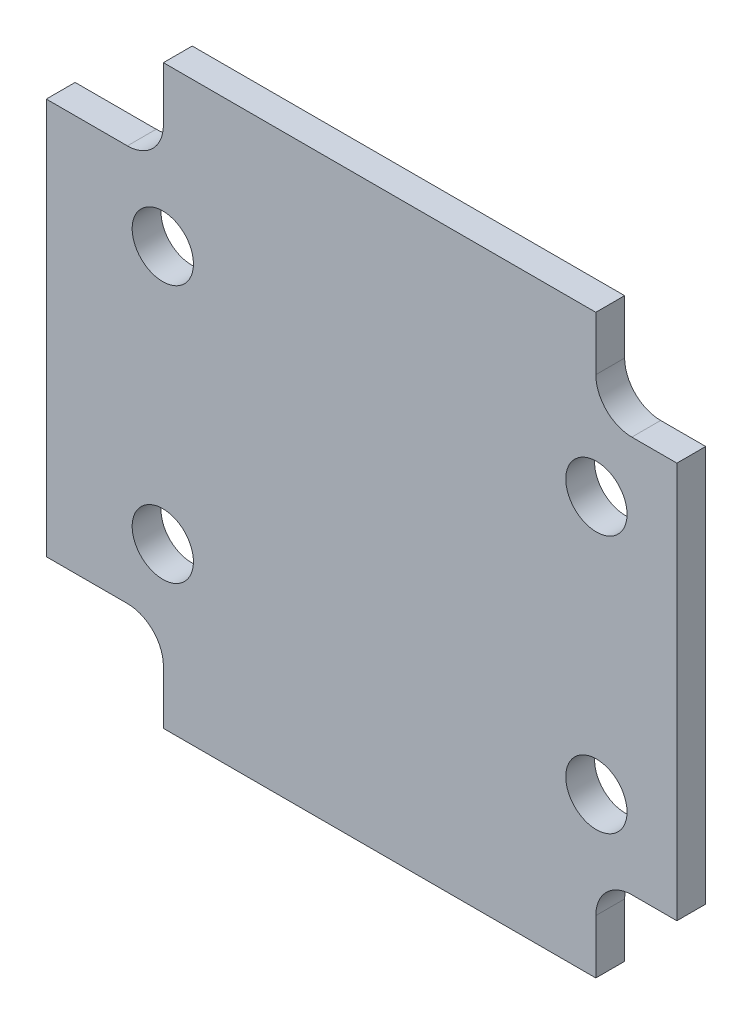
ISO-10303-21;
HEADER;
FILE_DESCRIPTION(('STEP AP214'),'2;1');
FILE_NAME('part.step','',(''),(''),'','','');
FILE_SCHEMA(('AUTOMOTIVE_DESIGN { 1 0 10303 214 1 1 1 1 }'));
ENDSEC;
DATA;
#1=APPLICATION_CONTEXT('core data for automotive mechanical design processes');
#2=APPLICATION_PROTOCOL_DEFINITION('international standard','automotive_design',2000,#1);
#3=PRODUCT_CONTEXT('',#1,'mechanical');
#4=PRODUCT('Part','Part','',(#3));
#5=PRODUCT_RELATED_PRODUCT_CATEGORY('part','',(#4));
#6=PRODUCT_DEFINITION_FORMATION('','',#4);
#7=PRODUCT_DEFINITION_CONTEXT('part definition',#1,'design');
#8=PRODUCT_DEFINITION('design','',#6,#7);
#9=PRODUCT_DEFINITION_SHAPE('','',#8);
#10=(LENGTH_UNIT() NAMED_UNIT(*) SI_UNIT(.MILLI.,.METRE.));
#11=(NAMED_UNIT(*) PLANE_ANGLE_UNIT() SI_UNIT($,.RADIAN.));
#12=(NAMED_UNIT(*) SI_UNIT($,.STERADIAN.) SOLID_ANGLE_UNIT());
#13=UNCERTAINTY_MEASURE_WITH_UNIT(LENGTH_MEASURE(1.E-05),#10,'distance_accuracy_value','');
#14=(GEOMETRIC_REPRESENTATION_CONTEXT(3) GLOBAL_UNCERTAINTY_ASSIGNED_CONTEXT((#13)) GLOBAL_UNIT_ASSIGNED_CONTEXT((#10,
#11,#12)) REPRESENTATION_CONTEXT('',''));
#15=CARTESIAN_POINT('',(0.,0.,0.));
#16=DIRECTION('',(0.,0.,1.));
#17=DIRECTION('',(1.,0.,0.));
#18=AXIS2_PLACEMENT_3D('',#15,#16,#17);
#19=CARTESIAN_POINT('',(0.,0.,1.6));
#20=DIRECTION('',(0.,0.,1.));
#21=DIRECTION('',(1.,0.,0.));
#22=AXIS2_PLACEMENT_3D('',#19,#20,#21);
#23=PLANE('',#22);
#24=CARTESIAN_POINT('',(-12.0335024322893,-7.15505550028011,1.6));
#25=DIRECTION('',(0.,0.,1.));
#26=DIRECTION('',(1.,0.,0.));
#27=AXIS2_PLACEMENT_3D('',#24,#25,#26);
#28=CIRCLE('',#27,1.69999999999999);
#29=CARTESIAN_POINT('',(-10.3335024322893,-7.15505550028011,1.6));
#30=VERTEX_POINT('',#29);
#31=EDGE_CURVE('E260',#30,#30,#28,.T.);
#32=ORIENTED_EDGE('',*,*,#31,.F.);
#33=EDGE_LOOP('',(#32));
#34=FACE_BOUND('',#33,.T.);
#35=CARTESIAN_POINT('',(12.0335024322893,-7.15505550028009,1.6));
#36=DIRECTION('',(0.,0.,1.));
#37=DIRECTION('',(1.,0.,0.));
#38=AXIS2_PLACEMENT_3D('',#35,#36,#37);
#39=CIRCLE('',#38,1.69999999999999);
#40=CARTESIAN_POINT('',(13.7335024322893,-7.15505550028009,1.6));
#41=VERTEX_POINT('',#40);
#42=EDGE_CURVE('E263',#41,#41,#39,.T.);
#43=ORIENTED_EDGE('',*,*,#42,.F.);
#44=EDGE_LOOP('',(#43));
#45=FACE_BOUND('',#44,.T.);
#46=CARTESIAN_POINT('',(12.0335024322893,7.1550555002801,1.6));
#47=DIRECTION('',(0.,0.,1.));
#48=DIRECTION('',(1.,0.,0.));
#49=AXIS2_PLACEMENT_3D('',#46,#47,#48);
#50=CIRCLE('',#49,1.69999999999999);
#51=CARTESIAN_POINT('',(13.7335024322893,7.1550555002801,1.6));
#52=VERTEX_POINT('',#51);
#53=EDGE_CURVE('E264',#52,#52,#50,.T.);
#54=ORIENTED_EDGE('',*,*,#53,.F.);
#55=EDGE_LOOP('',(#54));
#56=FACE_BOUND('',#55,.T.);
#57=CARTESIAN_POINT('',(-12.0335024322893,7.1550555002801,1.6));
#58=DIRECTION('',(0.,0.,1.));
#59=DIRECTION('',(1.,0.,0.));
#60=AXIS2_PLACEMENT_3D('',#57,#58,#59);
#61=CIRCLE('',#60,1.69999999999999);
#62=CARTESIAN_POINT('',(-10.3335024322893,7.1550555002801,1.6));
#63=VERTEX_POINT('',#62);
#64=EDGE_CURVE('E267',#63,#63,#61,.T.);
#65=ORIENTED_EDGE('',*,*,#64,.F.);
#66=EDGE_LOOP('',(#65));
#67=FACE_BOUND('',#66,.T.);
#68=DIRECTION('',(-1.,0.,0.));
#69=VECTOR('',#68,1.);
#70=CARTESIAN_POINT('',(18.5,-11.,1.6));
#71=LINE('',#70,#69);
#72=CARTESIAN_POINT('',(16.5,-11.,1.6));
#73=VERTEX_POINT('',#72);
#74=CARTESIAN_POINT('',(14.,-11.,1.6));
#75=VERTEX_POINT('',#74);
#76=EDGE_CURVE('E166',#73,#75,#71,.T.);
#77=ORIENTED_EDGE('',*,*,#76,.F.);
#78=DIRECTION('',(0.,-1.,0.));
#79=VECTOR('',#78,1.);
#80=CARTESIAN_POINT('',(16.5,12.4258371635256,1.6));
#81=LINE('',#80,#79);
#82=CARTESIAN_POINT('',(16.5,11.,1.6));
#83=VERTEX_POINT('',#82);
#84=EDGE_CURVE('E51',#83,#73,#81,.T.);
#85=ORIENTED_EDGE('',*,*,#84,.F.);
#86=DIRECTION('',(1.,0.,0.));
#87=VECTOR('',#86,1.);
#88=CARTESIAN_POINT('',(18.5,11.,1.6));
#89=LINE('',#88,#87);
#90=CARTESIAN_POINT('',(14.,11.,1.6));
#91=VERTEX_POINT('',#90);
#92=EDGE_CURVE('E180',#91,#83,#89,.T.);
#93=ORIENTED_EDGE('',*,*,#92,.F.);
#94=CARTESIAN_POINT('',(14.,13.,1.6));
#95=DIRECTION('',(0.,0.,1.));
#96=DIRECTION('',(1.,0.,0.));
#97=AXIS2_PLACEMENT_3D('',#94,#95,#96);
#98=CIRCLE('',#97,2.);
#99=CARTESIAN_POINT('',(12.,13.,1.6));
#100=VERTEX_POINT('',#99);
#101=EDGE_CURVE('E240',#91,#100,#98,.F.);
#102=ORIENTED_EDGE('',*,*,#101,.T.);
#103=DIRECTION('',(0.,-1.,0.));
#104=VECTOR('',#103,1.);
#105=CARTESIAN_POINT('',(12.,16.,1.6));
#106=LINE('',#105,#104);
#107=CARTESIAN_POINT('',(12.,16.,1.6));
#108=VERTEX_POINT('',#107);
#109=EDGE_CURVE('E176',#108,#100,#106,.T.);
#110=ORIENTED_EDGE('',*,*,#109,.F.);
#111=DIRECTION('',(-1.,0.,0.));
#112=VECTOR('',#111,1.);
#113=CARTESIAN_POINT('',(-18.5,16.,1.6));
#114=LINE('',#113,#112);
#115=CARTESIAN_POINT('',(-12.,16.,1.6));
#116=VERTEX_POINT('',#115);
#117=EDGE_CURVE('E204',#108,#116,#114,.T.);
#118=ORIENTED_EDGE('',*,*,#117,.T.);
#119=DIRECTION('',(0.,1.,0.));
#120=VECTOR('',#119,1.);
#121=CARTESIAN_POINT('',(-12.,16.,1.6));
#122=LINE('',#121,#120);
#123=CARTESIAN_POINT('',(-12.,13.,1.6));
#124=VERTEX_POINT('',#123);
#125=EDGE_CURVE('E193',#124,#116,#122,.T.);
#126=ORIENTED_EDGE('',*,*,#125,.F.);
#127=CARTESIAN_POINT('',(-14.,13.,1.6));
#128=DIRECTION('',(0.,0.,1.));
#129=DIRECTION('',(1.,0.,0.));
#130=AXIS2_PLACEMENT_3D('',#127,#128,#129);
#131=CIRCLE('',#130,2.);
#132=CARTESIAN_POINT('',(-14.,11.,1.6));
#133=VERTEX_POINT('',#132);
#134=EDGE_CURVE('E244',#124,#133,#131,.F.);
#135=ORIENTED_EDGE('',*,*,#134,.T.);
#136=DIRECTION('',(1.,0.,0.));
#137=VECTOR('',#136,1.);
#138=CARTESIAN_POINT('',(-18.5,11.,1.6));
#139=LINE('',#138,#137);
#140=CARTESIAN_POINT('',(-18.5,11.,1.6));
#141=VERTEX_POINT('',#140);
#142=EDGE_CURVE('E188',#141,#133,#139,.T.);
#143=ORIENTED_EDGE('',*,*,#142,.F.);
#144=DIRECTION('',(0.,-1.,0.));
#145=VECTOR('',#144,1.);
#146=CARTESIAN_POINT('',(-18.5,16.,1.6));
#147=LINE('',#146,#145);
#148=CARTESIAN_POINT('',(-18.5,-11.,1.6));
#149=VERTEX_POINT('',#148);
#150=EDGE_CURVE('E207',#141,#149,#147,.T.);
#151=ORIENTED_EDGE('',*,*,#150,.T.);
#152=DIRECTION('',(-1.,0.,0.));
#153=VECTOR('',#152,1.);
#154=CARTESIAN_POINT('',(-18.5,-11.,1.6));
#155=LINE('',#154,#153);
#156=CARTESIAN_POINT('',(-14.,-11.,1.6));
#157=VERTEX_POINT('',#156);
#158=EDGE_CURVE('E291',#157,#149,#155,.T.);
#159=ORIENTED_EDGE('',*,*,#158,.F.);
#160=CARTESIAN_POINT('',(-14.,-13.,1.6));
#161=DIRECTION('',(0.,0.,1.));
#162=DIRECTION('',(1.,0.,0.));
#163=AXIS2_PLACEMENT_3D('',#160,#161,#162);
#164=CIRCLE('',#163,2.);
#165=CARTESIAN_POINT('',(-12.,-13.,1.6));
#166=VERTEX_POINT('',#165);
#167=EDGE_CURVE('E248',#157,#166,#164,.F.);
#168=ORIENTED_EDGE('',*,*,#167,.T.);
#169=DIRECTION('',(0.,1.,0.));
#170=VECTOR('',#169,1.);
#171=CARTESIAN_POINT('',(-12.,-16.,1.6));
#172=LINE('',#171,#170);
#173=CARTESIAN_POINT('',(-12.,-16.,1.6));
#174=VERTEX_POINT('',#173);
#175=EDGE_CURVE('E259',#174,#166,#172,.T.);
#176=ORIENTED_EDGE('',*,*,#175,.F.);
#177=DIRECTION('',(1.,0.,0.));
#178=VECTOR('',#177,1.);
#179=CARTESIAN_POINT('',(-18.5,-16.,1.6));
#180=LINE('',#179,#178);
#181=CARTESIAN_POINT('',(12.,-16.,1.6));
#182=VERTEX_POINT('',#181);
#183=EDGE_CURVE('E211',#174,#182,#180,.T.);
#184=ORIENTED_EDGE('',*,*,#183,.T.);
#185=DIRECTION('',(0.,-1.,0.));
#186=VECTOR('',#185,1.);
#187=CARTESIAN_POINT('',(12.,-16.,1.6));
#188=LINE('',#187,#186);
#189=CARTESIAN_POINT('',(12.,-13.,1.6));
#190=VERTEX_POINT('',#189);
#191=EDGE_CURVE('E162',#190,#182,#188,.T.);
#192=ORIENTED_EDGE('',*,*,#191,.F.);
#193=CARTESIAN_POINT('',(14.,-13.,1.6));
#194=DIRECTION('',(0.,0.,1.));
#195=DIRECTION('',(1.,0.,0.));
#196=AXIS2_PLACEMENT_3D('',#193,#194,#195);
#197=CIRCLE('',#196,2.);
#198=EDGE_CURVE('E252',#190,#75,#197,.F.);
#199=ORIENTED_EDGE('',*,*,#198,.T.);
#200=EDGE_LOOP('',(#77,#85,#93,#102,#110,#118,#126,#135,#143,#151,#159,#168,#176,#184,#192,#199));
#201=FACE_BOUND('',#200,.T.);
#202=ADVANCED_FACE('F37',(#34,#45,#56,#67,#201),#23,.T.);
#203=CARTESIAN_POINT('',(0.,0.,0.));
#204=DIRECTION('',(0.,0.,1.));
#205=DIRECTION('',(1.,0.,0.));
#206=AXIS2_PLACEMENT_3D('',#203,#204,#205);
#207=PLANE('',#206);
#208=CARTESIAN_POINT('',(-12.0335024322893,-7.15505550028011,0.));
#209=DIRECTION('',(0.,0.,1.));
#210=DIRECTION('',(1.,0.,0.));
#211=AXIS2_PLACEMENT_3D('',#208,#209,#210);
#212=CIRCLE('',#211,1.69999999999999);
#213=CARTESIAN_POINT('',(-10.3335024322893,-7.15505550028011,0.));
#214=VERTEX_POINT('',#213);
#215=EDGE_CURVE('E256',#214,#214,#212,.T.);
#216=ORIENTED_EDGE('',*,*,#215,.T.);
#217=EDGE_LOOP('',(#216));
#218=FACE_BOUND('',#217,.T.);
#219=CARTESIAN_POINT('',(12.0335024322893,-7.15505550028009,0.));
#220=DIRECTION('',(0.,0.,1.));
#221=DIRECTION('',(1.,0.,0.));
#222=AXIS2_PLACEMENT_3D('',#219,#220,#221);
#223=CIRCLE('',#222,1.69999999999999);
#224=CARTESIAN_POINT('',(13.7335024322893,-7.15505550028009,0.));
#225=VERTEX_POINT('',#224);
#226=EDGE_CURVE('E282',#225,#225,#223,.T.);
#227=ORIENTED_EDGE('',*,*,#226,.T.);
#228=EDGE_LOOP('',(#227));
#229=FACE_BOUND('',#228,.T.);
#230=CARTESIAN_POINT('',(12.0335024322893,7.1550555002801,0.));
#231=DIRECTION('',(0.,0.,1.));
#232=DIRECTION('',(1.,0.,0.));
#233=AXIS2_PLACEMENT_3D('',#230,#231,#232);
#234=CIRCLE('',#233,1.69999999999999);
#235=CARTESIAN_POINT('',(13.7335024322892,7.1550555002801,0.));
#236=VERTEX_POINT('',#235);
#237=EDGE_CURVE('E261',#236,#236,#234,.T.);
#238=ORIENTED_EDGE('',*,*,#237,.T.);
#239=EDGE_LOOP('',(#238));
#240=FACE_BOUND('',#239,.T.);
#241=CARTESIAN_POINT('',(-12.0335024322893,7.1550555002801,0.));
#242=DIRECTION('',(0.,0.,1.));
#243=DIRECTION('',(1.,0.,0.));
#244=AXIS2_PLACEMENT_3D('',#241,#242,#243);
#245=CIRCLE('',#244,1.69999999999999);
#246=CARTESIAN_POINT('',(-10.3335024322893,7.1550555002801,0.));
#247=VERTEX_POINT('',#246);
#248=EDGE_CURVE('E265',#247,#247,#245,.T.);
#249=ORIENTED_EDGE('',*,*,#248,.T.);
#250=EDGE_LOOP('',(#249));
#251=FACE_BOUND('',#250,.T.);
#252=DIRECTION('',(0.,1.,0.));
#253=VECTOR('',#252,1.);
#254=CARTESIAN_POINT('',(16.5,12.4258371635256,0.));
#255=LINE('',#254,#253);
#256=CARTESIAN_POINT('',(16.5,-11.,0.));
#257=VERTEX_POINT('',#256);
#258=CARTESIAN_POINT('',(16.5,11.,0.));
#259=VERTEX_POINT('',#258);
#260=EDGE_CURVE('E148',#257,#259,#255,.T.);
#261=ORIENTED_EDGE('',*,*,#260,.F.);
#262=DIRECTION('',(-1.,0.,0.));
#263=VECTOR('',#262,1.);
#264=CARTESIAN_POINT('',(18.5,-11.,0.));
#265=LINE('',#264,#263);
#266=CARTESIAN_POINT('',(14.,-11.,0.));
#267=VERTEX_POINT('',#266);
#268=EDGE_CURVE('E59',#257,#267,#265,.T.);
#269=ORIENTED_EDGE('',*,*,#268,.T.);
#270=CARTESIAN_POINT('',(14.,-13.,0.));
#271=DIRECTION('',(0.,0.,1.));
#272=DIRECTION('',(1.,0.,0.));
#273=AXIS2_PLACEMENT_3D('',#270,#271,#272);
#274=CIRCLE('',#273,2.);
#275=CARTESIAN_POINT('',(12.,-13.,0.));
#276=VERTEX_POINT('',#275);
#277=EDGE_CURVE('E45',#267,#276,#274,.T.);
#278=ORIENTED_EDGE('',*,*,#277,.T.);
#279=DIRECTION('',(0.,-1.,0.));
#280=VECTOR('',#279,1.);
#281=CARTESIAN_POINT('',(12.,-16.,0.));
#282=LINE('',#281,#280);
#283=CARTESIAN_POINT('',(12.,-16.,0.));
#284=VERTEX_POINT('',#283);
#285=EDGE_CURVE('E161',#276,#284,#282,.T.);
#286=ORIENTED_EDGE('',*,*,#285,.T.);
#287=DIRECTION('',(1.,0.,0.));
#288=VECTOR('',#287,1.);
#289=CARTESIAN_POINT('',(-18.5,-16.,0.));
#290=LINE('',#289,#288);
#291=CARTESIAN_POINT('',(-12.,-16.,0.));
#292=VERTEX_POINT('',#291);
#293=EDGE_CURVE('E208',#292,#284,#290,.T.);
#294=ORIENTED_EDGE('',*,*,#293,.F.);
#295=DIRECTION('',(0.,1.,0.));
#296=VECTOR('',#295,1.);
#297=CARTESIAN_POINT('',(-12.,-16.,0.));
#298=LINE('',#297,#296);
#299=CARTESIAN_POINT('',(-12.,-13.,0.));
#300=VERTEX_POINT('',#299);
#301=EDGE_CURVE('E287',#292,#300,#298,.T.);
#302=ORIENTED_EDGE('',*,*,#301,.T.);
#303=CARTESIAN_POINT('',(-14.,-13.,0.));
#304=DIRECTION('',(0.,0.,1.));
#305=DIRECTION('',(1.,0.,0.));
#306=AXIS2_PLACEMENT_3D('',#303,#304,#305);
#307=CIRCLE('',#306,2.);
#308=CARTESIAN_POINT('',(-14.,-11.,0.));
#309=VERTEX_POINT('',#308);
#310=EDGE_CURVE('E250',#300,#309,#307,.T.);
#311=ORIENTED_EDGE('',*,*,#310,.T.);
#312=DIRECTION('',(-1.,0.,0.));
#313=VECTOR('',#312,1.);
#314=CARTESIAN_POINT('',(-18.5,-11.,0.));
#315=LINE('',#314,#313);
#316=CARTESIAN_POINT('',(-18.5,-11.,0.));
#317=VERTEX_POINT('',#316);
#318=EDGE_CURVE('E290',#309,#317,#315,.T.);
#319=ORIENTED_EDGE('',*,*,#318,.T.);
#320=DIRECTION('',(0.,-1.,0.));
#321=VECTOR('',#320,1.);
#322=CARTESIAN_POINT('',(-18.5,16.,0.));
#323=LINE('',#322,#321);
#324=CARTESIAN_POINT('',(-18.5,11.,0.));
#325=VERTEX_POINT('',#324);
#326=EDGE_CURVE('E217',#325,#317,#323,.T.);
#327=ORIENTED_EDGE('',*,*,#326,.F.);
#328=DIRECTION('',(1.,0.,0.));
#329=VECTOR('',#328,1.);
#330=CARTESIAN_POINT('',(-18.5,11.,0.));
#331=LINE('',#330,#329);
#332=CARTESIAN_POINT('',(-14.,11.,0.));
#333=VERTEX_POINT('',#332);
#334=EDGE_CURVE('E189',#325,#333,#331,.T.);
#335=ORIENTED_EDGE('',*,*,#334,.T.);
#336=CARTESIAN_POINT('',(-14.,13.,0.));
#337=DIRECTION('',(0.,0.,1.));
#338=DIRECTION('',(1.,0.,0.));
#339=AXIS2_PLACEMENT_3D('',#336,#337,#338);
#340=CIRCLE('',#339,2.);
#341=CARTESIAN_POINT('',(-12.,13.,0.));
#342=VERTEX_POINT('',#341);
#343=EDGE_CURVE('E246',#333,#342,#340,.T.);
#344=ORIENTED_EDGE('',*,*,#343,.T.);
#345=DIRECTION('',(0.,1.,0.));
#346=VECTOR('',#345,1.);
#347=CARTESIAN_POINT('',(-12.,16.,0.));
#348=LINE('',#347,#346);
#349=CARTESIAN_POINT('',(-12.,16.,0.));
#350=VERTEX_POINT('',#349);
#351=EDGE_CURVE('E192',#342,#350,#348,.T.);
#352=ORIENTED_EDGE('',*,*,#351,.T.);
#353=DIRECTION('',(-1.,0.,0.));
#354=VECTOR('',#353,1.);
#355=CARTESIAN_POINT('',(-18.5,16.,0.));
#356=LINE('',#355,#354);
#357=CARTESIAN_POINT('',(12.,16.,0.));
#358=VERTEX_POINT('',#357);
#359=EDGE_CURVE('E202',#358,#350,#356,.T.);
#360=ORIENTED_EDGE('',*,*,#359,.F.);
#361=DIRECTION('',(0.,-1.,0.));
#362=VECTOR('',#361,1.);
#363=CARTESIAN_POINT('',(12.,16.,0.));
#364=LINE('',#363,#362);
#365=CARTESIAN_POINT('',(12.,13.,0.));
#366=VERTEX_POINT('',#365);
#367=EDGE_CURVE('E177',#358,#366,#364,.T.);
#368=ORIENTED_EDGE('',*,*,#367,.T.);
#369=CARTESIAN_POINT('',(14.,13.,0.));
#370=DIRECTION('',(0.,0.,1.));
#371=DIRECTION('',(1.,0.,0.));
#372=AXIS2_PLACEMENT_3D('',#369,#370,#371);
#373=CIRCLE('',#372,2.);
#374=CARTESIAN_POINT('',(14.,11.,0.));
#375=VERTEX_POINT('',#374);
#376=EDGE_CURVE('E242',#366,#375,#373,.T.);
#377=ORIENTED_EDGE('',*,*,#376,.T.);
#378=DIRECTION('',(1.,0.,0.));
#379=VECTOR('',#378,1.);
#380=CARTESIAN_POINT('',(18.5,11.,0.));
#381=LINE('',#380,#379);
#382=EDGE_CURVE('E155',#375,#259,#381,.T.);
#383=ORIENTED_EDGE('',*,*,#382,.T.);
#384=EDGE_LOOP('',(#261,#269,#278,#286,#294,#302,#311,#319,#327,#335,#344,#352,#360,#368,#377,#383));
#385=FACE_BOUND('',#384,.T.);
#386=ADVANCED_FACE('F153',(#218,#229,#240,#251,#385),#207,.F.);
#387=CARTESIAN_POINT('',(18.5,11.,0.));
#388=DIRECTION('',(0.,-1.,0.));
#389=DIRECTION('',(1.,0.,0.));
#390=AXIS2_PLACEMENT_3D('',#387,#388,#389);
#391=PLANE('',#390);
#392=DIRECTION('',(0.,0.,1.));
#393=VECTOR('',#392,1.);
#394=CARTESIAN_POINT('',(16.5,11.,0.));
#395=LINE('',#394,#393);
#396=EDGE_CURVE('E273',#259,#83,#395,.T.);
#397=ORIENTED_EDGE('',*,*,#396,.F.);
#398=ORIENTED_EDGE('',*,*,#382,.F.);
#399=DIRECTION('',(0.,0.,1.));
#400=VECTOR('',#399,1.);
#401=CARTESIAN_POINT('',(14.,11.,1.6));
#402=LINE('',#401,#400);
#403=EDGE_CURVE('E214',#375,#91,#402,.T.);
#404=ORIENTED_EDGE('',*,*,#403,.T.);
#405=ORIENTED_EDGE('',*,*,#92,.T.);
#406=EDGE_LOOP('',(#397,#398,#404,#405));
#407=FACE_BOUND('',#406,.T.);
#408=ADVANCED_FACE('F353',(#407),#391,.F.);
#409=CARTESIAN_POINT('',(18.5,-11.,0.));
#410=DIRECTION('',(0.,1.,0.));
#411=DIRECTION('',(-1.,0.,0.));
#412=AXIS2_PLACEMENT_3D('',#409,#410,#411);
#413=PLANE('',#412);
#414=DIRECTION('',(0.,0.,-1.));
#415=VECTOR('',#414,1.);
#416=CARTESIAN_POINT('',(16.5,-11.,0.));
#417=LINE('',#416,#415);
#418=EDGE_CURVE('E11',#73,#257,#417,.T.);
#419=ORIENTED_EDGE('',*,*,#418,.F.);
#420=ORIENTED_EDGE('',*,*,#76,.T.);
#421=DIRECTION('',(0.,0.,1.));
#422=VECTOR('',#421,1.);
#423=CARTESIAN_POINT('',(14.,-11.,0.));
#424=LINE('',#423,#422);
#425=EDGE_CURVE('E159',#75,#267,#424,.F.);
#426=ORIENTED_EDGE('',*,*,#425,.T.);
#427=ORIENTED_EDGE('',*,*,#268,.F.);
#428=EDGE_LOOP('',(#419,#420,#426,#427));
#429=FACE_BOUND('',#428,.T.);
#430=ADVANCED_FACE('F157',(#429),#413,.F.);
#431=CARTESIAN_POINT('',(-18.5,16.,1.6));
#432=DIRECTION('',(0.,-1.,0.));
#433=DIRECTION('',(0.,0.,-1.));
#434=AXIS2_PLACEMENT_3D('',#431,#432,#433);
#435=PLANE('',#434);
#436=ORIENTED_EDGE('',*,*,#117,.F.);
#437=DIRECTION('',(0.,0.,1.));
#438=VECTOR('',#437,1.);
#439=CARTESIAN_POINT('',(12.,16.,0.));
#440=LINE('',#439,#438);
#441=EDGE_CURVE('E182',#358,#108,#440,.T.);
#442=ORIENTED_EDGE('',*,*,#441,.F.);
#443=ORIENTED_EDGE('',*,*,#359,.T.);
#444=DIRECTION('',(0.,0.,1.));
#445=VECTOR('',#444,1.);
#446=CARTESIAN_POINT('',(-12.,16.,0.));
#447=LINE('',#446,#445);
#448=EDGE_CURVE('E199',#350,#116,#447,.T.);
#449=ORIENTED_EDGE('',*,*,#448,.T.);
#450=EDGE_LOOP('',(#436,#442,#443,#449));
#451=FACE_BOUND('',#450,.T.);
#452=ADVANCED_FACE('F343',(#451),#435,.F.);
#453=CARTESIAN_POINT('',(-18.5,16.,1.6));
#454=DIRECTION('',(1.,0.,0.));
#455=DIRECTION('',(0.,1.,0.));
#456=AXIS2_PLACEMENT_3D('',#453,#454,#455);
#457=PLANE('',#456);
#458=ORIENTED_EDGE('',*,*,#326,.T.);
#459=DIRECTION('',(0.,0.,1.));
#460=VECTOR('',#459,1.);
#461=CARTESIAN_POINT('',(-18.5,-11.,0.));
#462=LINE('',#461,#460);
#463=EDGE_CURVE('E172',#317,#149,#462,.T.);
#464=ORIENTED_EDGE('',*,*,#463,.T.);
#465=ORIENTED_EDGE('',*,*,#150,.F.);
#466=DIRECTION('',(0.,0.,1.));
#467=VECTOR('',#466,1.);
#468=CARTESIAN_POINT('',(-18.5,11.,0.));
#469=LINE('',#468,#467);
#470=EDGE_CURVE('E195',#325,#141,#469,.T.);
#471=ORIENTED_EDGE('',*,*,#470,.F.);
#472=EDGE_LOOP('',(#458,#464,#465,#471));
#473=FACE_BOUND('',#472,.T.);
#474=ADVANCED_FACE('F326',(#473),#457,.F.);
#475=CARTESIAN_POINT('',(-18.5,-16.,1.6));
#476=DIRECTION('',(0.,1.,0.));
#477=DIRECTION('',(0.,0.,1.));
#478=AXIS2_PLACEMENT_3D('',#475,#476,#477);
#479=PLANE('',#478);
#480=ORIENTED_EDGE('',*,*,#183,.F.);
#481=DIRECTION('',(0.,0.,1.));
#482=VECTOR('',#481,1.);
#483=CARTESIAN_POINT('',(-12.,-16.,0.));
#484=LINE('',#483,#482);
#485=EDGE_CURVE('E169',#292,#174,#484,.T.);
#486=ORIENTED_EDGE('',*,*,#485,.F.);
#487=ORIENTED_EDGE('',*,*,#293,.T.);
#488=DIRECTION('',(0.,0.,1.));
#489=VECTOR('',#488,1.);
#490=CARTESIAN_POINT('',(12.,-16.,0.));
#491=LINE('',#490,#489);
#492=EDGE_CURVE('E164',#284,#182,#491,.T.);
#493=ORIENTED_EDGE('',*,*,#492,.T.);
#494=EDGE_LOOP('',(#480,#486,#487,#493));
#495=FACE_BOUND('',#494,.T.);
#496=ADVANCED_FACE('F310',(#495),#479,.F.);
#497=CARTESIAN_POINT('',(-12.,16.,0.));
#498=DIRECTION('',(1.,0.,0.));
#499=DIRECTION('',(0.,1.,0.));
#500=AXIS2_PLACEMENT_3D('',#497,#498,#499);
#501=PLANE('',#500);
#502=ORIENTED_EDGE('',*,*,#351,.F.);
#503=DIRECTION('',(0.,0.,1.));
#504=VECTOR('',#503,1.);
#505=CARTESIAN_POINT('',(-12.,13.,1.6));
#506=LINE('',#505,#504);
#507=EDGE_CURVE('E226',#342,#124,#506,.T.);
#508=ORIENTED_EDGE('',*,*,#507,.T.);
#509=ORIENTED_EDGE('',*,*,#125,.T.);
#510=ORIENTED_EDGE('',*,*,#448,.F.);
#511=EDGE_LOOP('',(#502,#508,#509,#510));
#512=FACE_BOUND('',#511,.T.);
#513=ADVANCED_FACE('F337',(#512),#501,.F.);
#514=CARTESIAN_POINT('',(-18.5,11.,0.));
#515=DIRECTION('',(0.,-1.,0.));
#516=DIRECTION('',(0.,0.,-1.));
#517=AXIS2_PLACEMENT_3D('',#514,#515,#516);
#518=PLANE('',#517);
#519=ORIENTED_EDGE('',*,*,#142,.T.);
#520=DIRECTION('',(0.,0.,1.));
#521=VECTOR('',#520,1.);
#522=CARTESIAN_POINT('',(-14.,11.,0.));
#523=LINE('',#522,#521);
#524=EDGE_CURVE('E229',#133,#333,#523,.F.);
#525=ORIENTED_EDGE('',*,*,#524,.T.);
#526=ORIENTED_EDGE('',*,*,#334,.F.);
#527=ORIENTED_EDGE('',*,*,#470,.T.);
#528=EDGE_LOOP('',(#519,#525,#526,#527));
#529=FACE_BOUND('',#528,.T.);
#530=ADVANCED_FACE('F356',(#529),#518,.F.);
#531=CARTESIAN_POINT('',(12.,16.,0.));
#532=DIRECTION('',(-1.,0.,0.));
#533=DIRECTION('',(0.,-1.,0.));
#534=AXIS2_PLACEMENT_3D('',#531,#532,#533);
#535=PLANE('',#534);
#536=ORIENTED_EDGE('',*,*,#109,.T.);
#537=DIRECTION('',(0.,0.,1.));
#538=VECTOR('',#537,1.);
#539=CARTESIAN_POINT('',(12.,13.,0.));
#540=LINE('',#539,#538);
#541=EDGE_CURVE('E224',#100,#366,#540,.F.);
#542=ORIENTED_EDGE('',*,*,#541,.T.);
#543=ORIENTED_EDGE('',*,*,#367,.F.);
#544=ORIENTED_EDGE('',*,*,#441,.T.);
#545=EDGE_LOOP('',(#536,#542,#543,#544));
#546=FACE_BOUND('',#545,.T.);
#547=ADVANCED_FACE('F354',(#546),#535,.F.);
#548=CARTESIAN_POINT('',(12.,-16.,0.));
#549=DIRECTION('',(-1.,0.,0.));
#550=DIRECTION('',(0.,-1.,0.));
#551=AXIS2_PLACEMENT_3D('',#548,#549,#550);
#552=PLANE('',#551);
#553=ORIENTED_EDGE('',*,*,#285,.F.);
#554=DIRECTION('',(0.,0.,1.));
#555=VECTOR('',#554,1.);
#556=CARTESIAN_POINT('',(12.,-13.,1.6));
#557=LINE('',#556,#555);
#558=EDGE_CURVE('E236',#276,#190,#557,.T.);
#559=ORIENTED_EDGE('',*,*,#558,.T.);
#560=ORIENTED_EDGE('',*,*,#191,.T.);
#561=ORIENTED_EDGE('',*,*,#492,.F.);
#562=EDGE_LOOP('',(#553,#559,#560,#561));
#563=FACE_BOUND('',#562,.T.);
#564=ADVANCED_FACE('F314',(#563),#552,.F.);
#565=CARTESIAN_POINT('',(-18.5,-11.,0.));
#566=DIRECTION('',(0.,1.,0.));
#567=DIRECTION('',(0.,0.,1.));
#568=AXIS2_PLACEMENT_3D('',#565,#566,#567);
#569=PLANE('',#568);
#570=ORIENTED_EDGE('',*,*,#318,.F.);
#571=DIRECTION('',(0.,0.,1.));
#572=VECTOR('',#571,1.);
#573=CARTESIAN_POINT('',(-14.,-11.,1.6));
#574=LINE('',#573,#572);
#575=EDGE_CURVE('E231',#309,#157,#574,.T.);
#576=ORIENTED_EDGE('',*,*,#575,.T.);
#577=ORIENTED_EDGE('',*,*,#158,.T.);
#578=ORIENTED_EDGE('',*,*,#463,.F.);
#579=EDGE_LOOP('',(#570,#576,#577,#578));
#580=FACE_BOUND('',#579,.T.);
#581=ADVANCED_FACE('F323',(#580),#569,.F.);
#582=CARTESIAN_POINT('',(-12.,-16.,0.));
#583=DIRECTION('',(1.,0.,0.));
#584=DIRECTION('',(0.,1.,0.));
#585=AXIS2_PLACEMENT_3D('',#582,#583,#584);
#586=PLANE('',#585);
#587=ORIENTED_EDGE('',*,*,#175,.T.);
#588=DIRECTION('',(0.,0.,1.));
#589=VECTOR('',#588,1.);
#590=CARTESIAN_POINT('',(-12.,-13.,0.));
#591=LINE('',#590,#589);
#592=EDGE_CURVE('E234',#166,#300,#591,.F.);
#593=ORIENTED_EDGE('',*,*,#592,.T.);
#594=ORIENTED_EDGE('',*,*,#301,.F.);
#595=ORIENTED_EDGE('',*,*,#485,.T.);
#596=EDGE_LOOP('',(#587,#593,#594,#595));
#597=FACE_BOUND('',#596,.T.);
#598=ADVANCED_FACE('F302',(#597),#586,.F.);
#599=CARTESIAN_POINT('',(14.,13.,0.));
#600=DIRECTION('',(0.,0.,-1.));
#601=DIRECTION('',(-1.,0.,0.));
#602=AXIS2_PLACEMENT_3D('',#599,#600,#601);
#603=CYLINDRICAL_SURFACE('',#602,2.);
#604=ORIENTED_EDGE('',*,*,#376,.F.);
#605=ORIENTED_EDGE('',*,*,#541,.F.);
#606=ORIENTED_EDGE('',*,*,#101,.F.);
#607=ORIENTED_EDGE('',*,*,#403,.F.);
#608=EDGE_LOOP('',(#604,#605,#606,#607));
#609=FACE_BOUND('',#608,.T.);
#610=ADVANCED_FACE('F350',(#609),#603,.F.);
#611=CARTESIAN_POINT('',(-14.,13.,0.));
#612=DIRECTION('',(0.,0.,-1.));
#613=DIRECTION('',(-1.,0.,0.));
#614=AXIS2_PLACEMENT_3D('',#611,#612,#613);
#615=CYLINDRICAL_SURFACE('',#614,2.);
#616=ORIENTED_EDGE('',*,*,#343,.F.);
#617=ORIENTED_EDGE('',*,*,#524,.F.);
#618=ORIENTED_EDGE('',*,*,#134,.F.);
#619=ORIENTED_EDGE('',*,*,#507,.F.);
#620=EDGE_LOOP('',(#616,#617,#618,#619));
#621=FACE_BOUND('',#620,.T.);
#622=ADVANCED_FACE('F334',(#621),#615,.F.);
#623=CARTESIAN_POINT('',(-14.,-13.,0.));
#624=DIRECTION('',(0.,0.,-1.));
#625=DIRECTION('',(-1.,0.,0.));
#626=AXIS2_PLACEMENT_3D('',#623,#624,#625);
#627=CYLINDRICAL_SURFACE('',#626,2.);
#628=ORIENTED_EDGE('',*,*,#310,.F.);
#629=ORIENTED_EDGE('',*,*,#592,.F.);
#630=ORIENTED_EDGE('',*,*,#167,.F.);
#631=ORIENTED_EDGE('',*,*,#575,.F.);
#632=EDGE_LOOP('',(#628,#629,#630,#631));
#633=FACE_BOUND('',#632,.T.);
#634=ADVANCED_FACE('F321',(#633),#627,.F.);
#635=CARTESIAN_POINT('',(14.,-13.,0.));
#636=DIRECTION('',(0.,0.,-1.));
#637=DIRECTION('',(-1.,0.,0.));
#638=AXIS2_PLACEMENT_3D('',#635,#636,#637);
#639=CYLINDRICAL_SURFACE('',#638,2.);
#640=ORIENTED_EDGE('',*,*,#277,.F.);
#641=ORIENTED_EDGE('',*,*,#425,.F.);
#642=ORIENTED_EDGE('',*,*,#198,.F.);
#643=ORIENTED_EDGE('',*,*,#558,.F.);
#644=EDGE_LOOP('',(#640,#641,#642,#643));
#645=FACE_BOUND('',#644,.T.);
#646=ADVANCED_FACE('F39',(#645),#639,.F.);
#647=CARTESIAN_POINT('',(-12.0335024322893,-7.15505550028011,1.6));
#648=DIRECTION('',(0.,0.,1.));
#649=DIRECTION('',(1.,0.,0.));
#650=AXIS2_PLACEMENT_3D('',#647,#648,#649);
#651=CYLINDRICAL_SURFACE('',#650,1.69999999999999);
#652=ORIENTED_EDGE('',*,*,#31,.T.);
#653=EDGE_LOOP('',(#652));
#654=FACE_BOUND('',#653,.T.);
#655=ORIENTED_EDGE('',*,*,#215,.F.);
#656=EDGE_LOOP('',(#655));
#657=FACE_BOUND('',#656,.T.);
#658=ADVANCED_FACE('F391',(#654,#657),#651,.F.);
#659=CARTESIAN_POINT('',(12.0335024322893,-7.15505550028009,1.6));
#660=DIRECTION('',(0.,0.,1.));
#661=DIRECTION('',(1.,0.,0.));
#662=AXIS2_PLACEMENT_3D('',#659,#660,#661);
#663=CYLINDRICAL_SURFACE('',#662,1.69999999999999);
#664=ORIENTED_EDGE('',*,*,#42,.T.);
#665=EDGE_LOOP('',(#664));
#666=FACE_BOUND('',#665,.T.);
#667=ORIENTED_EDGE('',*,*,#226,.F.);
#668=EDGE_LOOP('',(#667));
#669=FACE_BOUND('',#668,.T.);
#670=ADVANCED_FACE('F395',(#666,#669),#663,.F.);
#671=CARTESIAN_POINT('',(12.0335024322893,7.1550555002801,1.6));
#672=DIRECTION('',(0.,0.,1.));
#673=DIRECTION('',(1.,0.,0.));
#674=AXIS2_PLACEMENT_3D('',#671,#672,#673);
#675=CYLINDRICAL_SURFACE('',#674,1.69999999999999);
#676=ORIENTED_EDGE('',*,*,#53,.T.);
#677=EDGE_LOOP('',(#676));
#678=FACE_BOUND('',#677,.T.);
#679=ORIENTED_EDGE('',*,*,#237,.F.);
#680=EDGE_LOOP('',(#679));
#681=FACE_BOUND('',#680,.T.);
#682=ADVANCED_FACE('F401',(#678,#681),#675,.F.);
#683=CARTESIAN_POINT('',(-12.0335024322893,7.1550555002801,1.6));
#684=DIRECTION('',(0.,0.,1.));
#685=DIRECTION('',(1.,0.,0.));
#686=AXIS2_PLACEMENT_3D('',#683,#684,#685);
#687=CYLINDRICAL_SURFACE('',#686,1.69999999999999);
#688=ORIENTED_EDGE('',*,*,#64,.T.);
#689=EDGE_LOOP('',(#688));
#690=FACE_BOUND('',#689,.T.);
#691=ORIENTED_EDGE('',*,*,#248,.F.);
#692=EDGE_LOOP('',(#691));
#693=FACE_BOUND('',#692,.T.);
#694=ADVANCED_FACE('F430',(#690,#693),#687,.F.);
#695=CARTESIAN_POINT('',(16.5,0.,0.));
#696=DIRECTION('',(1.,0.,0.));
#697=DIRECTION('',(0.,1.,0.));
#698=AXIS2_PLACEMENT_3D('',#695,#696,#697);
#699=PLANE('',#698);
#700=ORIENTED_EDGE('',*,*,#396,.T.);
#701=ORIENTED_EDGE('',*,*,#84,.T.);
#702=ORIENTED_EDGE('',*,*,#418,.T.);
#703=ORIENTED_EDGE('',*,*,#260,.T.);
#704=EDGE_LOOP('',(#700,#701,#702,#703));
#705=FACE_BOUND('',#704,.T.);
#706=ADVANCED_FACE('F147',(#705),#699,.T.);
#707=CLOSED_SHELL('',(#202,#386,#408,#430,#452,#474,#496,#513,#530,#547,#564,#581,#598,#610,
#622,#634,#646,#658,#670,#682,#694,#706));
#708=MANIFOLD_SOLID_BREP('B2',#707);
#709=ADVANCED_BREP_SHAPE_REPRESENTATION('',(#18,#708),#14);
#710=SHAPE_DEFINITION_REPRESENTATION(#9,#709);
ENDSEC;
END-ISO-10303-21;
